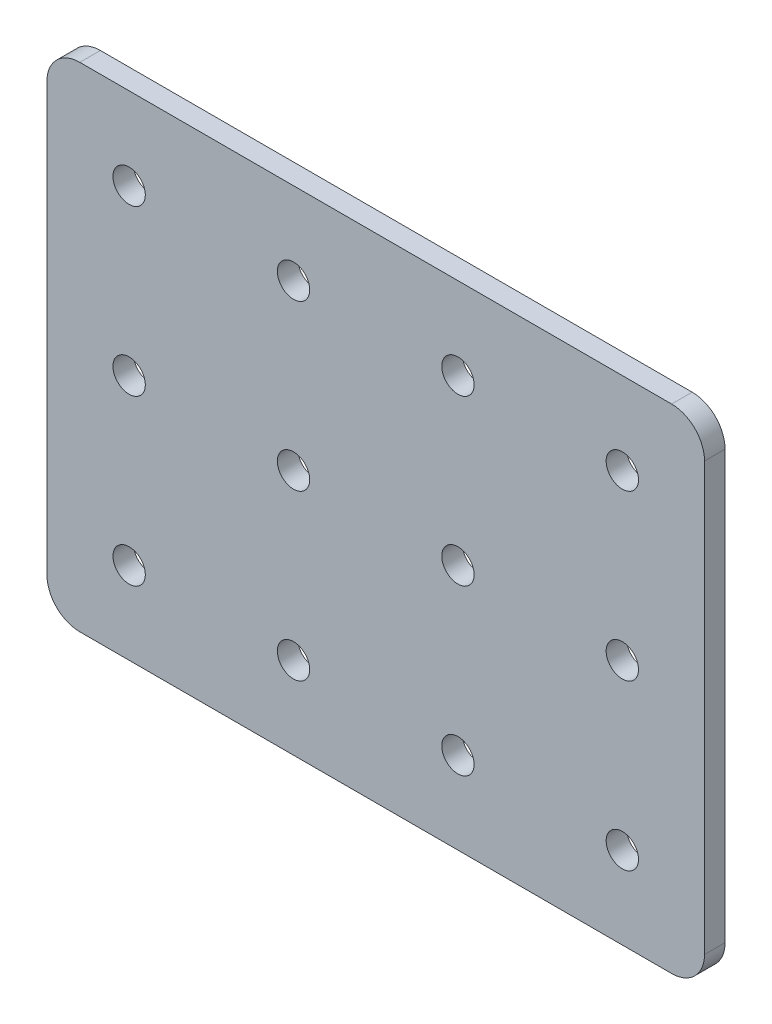
ISO-10303-21;
HEADER;
FILE_DESCRIPTION(('STEP AP214'),'2;1');
FILE_NAME('part.step','',(''),(''),'','','');
FILE_SCHEMA(('AUTOMOTIVE_DESIGN { 1 0 10303 214 1 1 1 1 }'));
ENDSEC;
DATA;
#1=APPLICATION_CONTEXT('core data for automotive mechanical design processes');
#2=APPLICATION_PROTOCOL_DEFINITION('international standard','automotive_design',2000,#1);
#3=PRODUCT_CONTEXT('',#1,'mechanical');
#4=PRODUCT('Part','Part','',(#3));
#5=PRODUCT_RELATED_PRODUCT_CATEGORY('part','',(#4));
#6=PRODUCT_DEFINITION_FORMATION('','',#4);
#7=PRODUCT_DEFINITION_CONTEXT('part definition',#1,'design');
#8=PRODUCT_DEFINITION('design','',#6,#7);
#9=PRODUCT_DEFINITION_SHAPE('','',#8);
#10=(LENGTH_UNIT() NAMED_UNIT(*) SI_UNIT(.MILLI.,.METRE.));
#11=(NAMED_UNIT(*) PLANE_ANGLE_UNIT() SI_UNIT($,.RADIAN.));
#12=(NAMED_UNIT(*) SI_UNIT($,.STERADIAN.) SOLID_ANGLE_UNIT());
#13=UNCERTAINTY_MEASURE_WITH_UNIT(LENGTH_MEASURE(1.E-05),#10,'distance_accuracy_value','');
#14=(GEOMETRIC_REPRESENTATION_CONTEXT(3) GLOBAL_UNCERTAINTY_ASSIGNED_CONTEXT((#13)) GLOBAL_UNIT_ASSIGNED_CONTEXT((#10,
#11,#12)) REPRESENTATION_CONTEXT('',''));
#15=CARTESIAN_POINT('',(0.,0.,0.));
#16=DIRECTION('',(0.,0.,1.));
#17=DIRECTION('',(1.,0.,0.));
#18=AXIS2_PLACEMENT_3D('',#15,#16,#17);
#19=CARTESIAN_POINT('',(71.12,71.1200000015277,-3251.19999999565));
#20=DIRECTION('',(0.,0.,-1.));
#21=DIRECTION('',(0.,1.,0.));
#22=AXIS2_PLACEMENT_3D('',#19,#20,#21);
#23=PLANE('',#22);
#24=CARTESIAN_POINT('',(63.5000000000037,38.1000000000156,-3251.19999999565));
#25=DIRECTION('',(0.,0.,-1.));
#26=DIRECTION('',(0.,1.,0.));
#27=AXIS2_PLACEMENT_3D('',#24,#25,#26);
#28=CIRCLE('',#27,2.4999999999987);
#29=CARTESIAN_POINT('',(63.5000000000037,40.6000000000143,-3251.19999999565));
#30=VERTEX_POINT('',#29);
#31=EDGE_CURVE('E688',#30,#30,#28,.T.);
#32=ORIENTED_EDGE('',*,*,#31,.F.);
#33=EDGE_LOOP('',(#32));
#34=FACE_BOUND('',#33,.T.);
#35=CARTESIAN_POINT('',(12.7000000000036,63.5000000000153,-3251.19999999565));
#36=DIRECTION('',(0.,0.,-1.));
#37=DIRECTION('',(0.,1.,0.));
#38=AXIS2_PLACEMENT_3D('',#35,#36,#37);
#39=CIRCLE('',#38,2.4999999999987);
#40=CARTESIAN_POINT('',(12.7000000000036,66.000000000014,-3251.19999999565));
#41=VERTEX_POINT('',#40);
#42=EDGE_CURVE('E700',#41,#41,#39,.T.);
#43=ORIENTED_EDGE('',*,*,#42,.F.);
#44=EDGE_LOOP('',(#43));
#45=FACE_BOUND('',#44,.T.);
#46=CARTESIAN_POINT('',(-12.6999999999963,38.1000000000151,-3251.19999999565));
#47=DIRECTION('',(0.,0.,-1.));
#48=DIRECTION('',(0.,1.,0.));
#49=AXIS2_PLACEMENT_3D('',#46,#47,#48);
#50=CIRCLE('',#49,2.4999999999987);
#51=CARTESIAN_POINT('',(-12.6999999999963,40.6000000000138,-3251.19999999565));
#52=VERTEX_POINT('',#51);
#53=EDGE_CURVE('E712',#52,#52,#50,.T.);
#54=ORIENTED_EDGE('',*,*,#53,.F.);
#55=EDGE_LOOP('',(#54));
#56=FACE_BOUND('',#55,.T.);
#57=CARTESIAN_POINT('',(38.1000000000037,38.1000000000155,-3251.19999999565));
#58=DIRECTION('',(0.,0.,-1.));
#59=DIRECTION('',(0.,1.,0.));
#60=AXIS2_PLACEMENT_3D('',#57,#58,#59);
#61=CIRCLE('',#60,2.4999999999987);
#62=CARTESIAN_POINT('',(38.1000000000037,40.6000000000142,-3251.19999999565));
#63=VERTEX_POINT('',#62);
#64=EDGE_CURVE('E724',#63,#63,#61,.T.);
#65=ORIENTED_EDGE('',*,*,#64,.F.);
#66=EDGE_LOOP('',(#65));
#67=FACE_BOUND('',#66,.T.);
#68=CARTESIAN_POINT('',(12.7000000000038,12.7000000000146,-3251.19999999565));
#69=DIRECTION('',(0.,0.,-1.));
#70=DIRECTION('',(0.,1.,0.));
#71=AXIS2_PLACEMENT_3D('',#68,#69,#70);
#72=CIRCLE('',#71,2.49999999999886);
#73=CARTESIAN_POINT('',(12.7000000000038,15.2000000000135,-3251.19999999565));
#74=VERTEX_POINT('',#73);
#75=EDGE_CURVE('E736',#74,#74,#72,.T.);
#76=ORIENTED_EDGE('',*,*,#75,.F.);
#77=EDGE_LOOP('',(#76));
#78=FACE_BOUND('',#77,.T.);
#79=CARTESIAN_POINT('',(63.5000000000038,12.7000000000156,-3251.19999999565));
#80=DIRECTION('',(0.,0.,-1.));
#81=DIRECTION('',(0.,1.,0.));
#82=AXIS2_PLACEMENT_3D('',#79,#80,#81);
#83=CIRCLE('',#82,2.4999999999987);
#84=CARTESIAN_POINT('',(63.5000000000038,15.2000000000143,-3251.19999999565));
#85=VERTEX_POINT('',#84);
#86=EDGE_CURVE('E456',#85,#85,#83,.T.);
#87=ORIENTED_EDGE('',*,*,#86,.F.);
#88=EDGE_LOOP('',(#87));
#89=FACE_BOUND('',#88,.T.);
#90=DIRECTION('',(0.,1.,0.));
#91=VECTOR('',#90,1.);
#92=CARTESIAN_POINT('',(76.2000000000005,76.2000000000041,-3251.19999999565));
#93=LINE('',#92,#91);
#94=CARTESIAN_POINT('',(76.1999999999938,5.08000000000008,-3251.19999999565));
#95=VERTEX_POINT('',#94);
#96=CARTESIAN_POINT('',(76.2,71.1200000015277,-3251.19999999565));
#97=VERTEX_POINT('',#96);
#98=EDGE_CURVE('E469',#95,#97,#93,.T.);
#99=ORIENTED_EDGE('',*,*,#98,.F.);
#100=CARTESIAN_POINT('',(71.1199999999938,5.08000000000008,-3251.19999999565));
#101=DIRECTION('',(0.,0.,-1.));
#102=DIRECTION('',(0.,1.,0.));
#103=AXIS2_PLACEMENT_3D('',#100,#101,#102);
#104=CIRCLE('',#103,5.07999999999999);
#105=CARTESIAN_POINT('',(71.1199999999938,0.,-3251.19999999565));
#106=VERTEX_POINT('',#105);
#107=EDGE_CURVE('E447',#95,#106,#104,.T.);
#108=ORIENTED_EDGE('',*,*,#107,.T.);
#109=DIRECTION('',(1.,0.,0.));
#110=VECTOR('',#109,1.);
#111=CARTESIAN_POINT('',(25.4,0.,-3251.19999999565));
#112=LINE('',#111,#110);
#113=CARTESIAN_POINT('',(-20.3199999999999,0.,-3251.19999999565));
#114=VERTEX_POINT('',#113);
#115=EDGE_CURVE('E432',#114,#106,#112,.T.);
#116=ORIENTED_EDGE('',*,*,#115,.F.);
#117=CARTESIAN_POINT('',(-20.32,5.08000000000003,-3251.19999999565));
#118=DIRECTION('',(0.,0.,-1.));
#119=DIRECTION('',(0.,1.,0.));
#120=AXIS2_PLACEMENT_3D('',#117,#118,#119);
#121=CIRCLE('',#120,5.08);
#122=CARTESIAN_POINT('',(-25.4,5.08000000000008,-3251.19999999565));
#123=VERTEX_POINT('',#122);
#124=EDGE_CURVE('E440',#114,#123,#121,.T.);
#125=ORIENTED_EDGE('',*,*,#124,.T.);
#126=DIRECTION('',(0.,1.,0.));
#127=VECTOR('',#126,1.);
#128=CARTESIAN_POINT('',(-25.4,76.2000000000089,-3251.19999999565));
#129=LINE('',#128,#127);
#130=CARTESIAN_POINT('',(-25.4,71.1200000015277,-3251.19999999565));
#131=VERTEX_POINT('',#130);
#132=EDGE_CURVE('E444',#123,#131,#129,.T.);
#133=ORIENTED_EDGE('',*,*,#132,.T.);
#134=CARTESIAN_POINT('',(-20.32,71.1200000015277,-3251.19999999565));
#135=DIRECTION('',(0.,0.,-1.));
#136=DIRECTION('',(0.,1.,0.));
#137=AXIS2_PLACEMENT_3D('',#134,#135,#136);
#138=CIRCLE('',#137,5.08000000000001);
#139=CARTESIAN_POINT('',(-20.32,76.2000000015277,-3251.19999999565));
#140=VERTEX_POINT('',#139);
#141=EDGE_CURVE('E497',#131,#140,#138,.T.);
#142=ORIENTED_EDGE('',*,*,#141,.T.);
#143=DIRECTION('',(1.,0.,0.));
#144=VECTOR('',#143,1.);
#145=CARTESIAN_POINT('',(25.4,76.2000000015277,-3251.19999999565));
#146=LINE('',#145,#144);
#147=CARTESIAN_POINT('',(71.12,76.2000000015277,-3251.19999999565));
#148=VERTEX_POINT('',#147);
#149=EDGE_CURVE('E490',#140,#148,#146,.T.);
#150=ORIENTED_EDGE('',*,*,#149,.T.);
#151=CARTESIAN_POINT('',(71.12,71.1200000015277,-3251.19999999565));
#152=DIRECTION('',(0.,0.,-1.));
#153=DIRECTION('',(0.,1.,0.));
#154=AXIS2_PLACEMENT_3D('',#151,#152,#153);
#155=CIRCLE('',#154,5.08);
#156=EDGE_CURVE('E415',#148,#97,#155,.T.);
#157=ORIENTED_EDGE('',*,*,#156,.T.);
#158=EDGE_LOOP('',(#99,#108,#116,#125,#133,#142,#150,#157));
#159=FACE_BOUND('',#158,.T.);
#160=CARTESIAN_POINT('',(-12.6999999999962,12.700000000014,-3251.19999999565));
#161=DIRECTION('',(0.,0.,-1.));
#162=DIRECTION('',(0.,1.,0.));
#163=AXIS2_PLACEMENT_3D('',#160,#161,#162);
#164=CIRCLE('',#163,2.49999999999887);
#165=CARTESIAN_POINT('',(-12.6999999999962,15.2000000000129,-3251.19999999565));
#166=VERTEX_POINT('',#165);
#167=EDGE_CURVE('E742',#166,#166,#164,.T.);
#168=ORIENTED_EDGE('',*,*,#167,.F.);
#169=EDGE_LOOP('',(#168));
#170=FACE_BOUND('',#169,.T.);
#171=CARTESIAN_POINT('',(38.1000000000038,12.7000000000151,-3251.19999999565));
#172=DIRECTION('',(0.,0.,-1.));
#173=DIRECTION('',(0.,1.,0.));
#174=AXIS2_PLACEMENT_3D('',#171,#172,#173);
#175=CIRCLE('',#174,2.49999999999887);
#176=CARTESIAN_POINT('',(38.1000000000038,15.200000000014,-3251.19999999565));
#177=VERTEX_POINT('',#176);
#178=EDGE_CURVE('E730',#177,#177,#175,.T.);
#179=ORIENTED_EDGE('',*,*,#178,.F.);
#180=EDGE_LOOP('',(#179));
#181=FACE_BOUND('',#180,.T.);
#182=CARTESIAN_POINT('',(12.7000000000037,38.1000000000153,-3251.19999999565));
#183=DIRECTION('',(0.,0.,-1.));
#184=DIRECTION('',(0.,1.,0.));
#185=AXIS2_PLACEMENT_3D('',#182,#183,#184);
#186=CIRCLE('',#185,2.4999999999987);
#187=CARTESIAN_POINT('',(12.7000000000037,40.600000000014,-3251.19999999565));
#188=VERTEX_POINT('',#187);
#189=EDGE_CURVE('E718',#188,#188,#186,.T.);
#190=ORIENTED_EDGE('',*,*,#189,.F.);
#191=EDGE_LOOP('',(#190));
#192=FACE_BOUND('',#191,.T.);
#193=CARTESIAN_POINT('',(38.1000000000036,63.5000000000154,-3251.19999999565));
#194=DIRECTION('',(0.,0.,-1.));
#195=DIRECTION('',(0.,1.,0.));
#196=AXIS2_PLACEMENT_3D('',#193,#194,#195);
#197=CIRCLE('',#196,2.4999999999987);
#198=CARTESIAN_POINT('',(38.1000000000036,66.0000000000141,-3251.19999999565));
#199=VERTEX_POINT('',#198);
#200=EDGE_CURVE('E706',#199,#199,#197,.T.);
#201=ORIENTED_EDGE('',*,*,#200,.F.);
#202=EDGE_LOOP('',(#201));
#203=FACE_BOUND('',#202,.T.);
#204=CARTESIAN_POINT('',(-12.6999999999964,63.5000000000151,-3251.19999999565));
#205=DIRECTION('',(0.,0.,-1.));
#206=DIRECTION('',(0.,1.,0.));
#207=AXIS2_PLACEMENT_3D('',#204,#205,#206);
#208=CIRCLE('',#207,2.4999999999987);
#209=CARTESIAN_POINT('',(-12.6999999999964,66.0000000000138,-3251.19999999565));
#210=VERTEX_POINT('',#209);
#211=EDGE_CURVE('E694',#210,#210,#208,.T.);
#212=ORIENTED_EDGE('',*,*,#211,.F.);
#213=EDGE_LOOP('',(#212));
#214=FACE_BOUND('',#213,.T.);
#215=CARTESIAN_POINT('',(63.5000000000036,63.5000000000156,-3251.19999999565));
#216=DIRECTION('',(0.,0.,-1.));
#217=DIRECTION('',(0.,1.,0.));
#218=AXIS2_PLACEMENT_3D('',#215,#216,#217);
#219=CIRCLE('',#218,2.4999999999987);
#220=CARTESIAN_POINT('',(63.5000000000036,66.0000000000143,-3251.19999999565));
#221=VERTEX_POINT('',#220);
#222=EDGE_CURVE('E679',#221,#221,#219,.T.);
#223=ORIENTED_EDGE('',*,*,#222,.F.);
#224=EDGE_LOOP('',(#223));
#225=FACE_BOUND('',#224,.T.);
#226=ADVANCED_FACE('F357',(#34,#45,#56,#67,#78,#89,#159,#170,#181,#192,#203,#214,#225),#23,.T.);
#227=CARTESIAN_POINT('',(71.12,71.1200000015277,-3248.02499999565));
#228=DIRECTION('',(0.,0.,-1.));
#229=DIRECTION('',(0.,1.,0.));
#230=AXIS2_PLACEMENT_3D('',#227,#228,#229);
#231=PLANE('',#230);
#232=DIRECTION('',(0.,1.,0.));
#233=VECTOR('',#232,1.);
#234=CARTESIAN_POINT('',(76.2000000000005,76.2000000000041,-3248.02499999565));
#235=LINE('',#234,#233);
#236=CARTESIAN_POINT('',(76.1999999999938,5.08000000000008,-3248.02499999565));
#237=VERTEX_POINT('',#236);
#238=CARTESIAN_POINT('',(76.2,71.1200000015277,-3248.02499999565));
#239=VERTEX_POINT('',#238);
#240=EDGE_CURVE('E452',#237,#239,#235,.T.);
#241=ORIENTED_EDGE('',*,*,#240,.T.);
#242=CARTESIAN_POINT('',(71.12,71.1200000015277,-3248.02499999565));
#243=DIRECTION('',(0.,0.,-1.));
#244=DIRECTION('',(0.,1.,0.));
#245=AXIS2_PLACEMENT_3D('',#242,#243,#244);
#246=CIRCLE('',#245,5.08);
#247=CARTESIAN_POINT('',(71.12,76.2000000015277,-3248.02499999565));
#248=VERTEX_POINT('',#247);
#249=EDGE_CURVE('E455',#248,#239,#246,.T.);
#250=ORIENTED_EDGE('',*,*,#249,.F.);
#251=DIRECTION('',(1.,0.,0.));
#252=VECTOR('',#251,1.);
#253=CARTESIAN_POINT('',(25.4,76.2000000015277,-3248.02499999565));
#254=LINE('',#253,#252);
#255=CARTESIAN_POINT('',(-20.32,76.2000000015277,-3248.02499999565));
#256=VERTEX_POINT('',#255);
#257=EDGE_CURVE('E459',#256,#248,#254,.T.);
#258=ORIENTED_EDGE('',*,*,#257,.F.);
#259=CARTESIAN_POINT('',(-20.32,71.1200000015277,-3248.02499999565));
#260=DIRECTION('',(0.,0.,-1.));
#261=DIRECTION('',(0.,1.,0.));
#262=AXIS2_PLACEMENT_3D('',#259,#260,#261);
#263=CIRCLE('',#262,5.08000000000001);
#264=CARTESIAN_POINT('',(-25.4,71.1200000015277,-3248.02499999565));
#265=VERTEX_POINT('',#264);
#266=EDGE_CURVE('E461',#265,#256,#263,.T.);
#267=ORIENTED_EDGE('',*,*,#266,.F.);
#268=DIRECTION('',(0.,1.,0.));
#269=VECTOR('',#268,1.);
#270=CARTESIAN_POINT('',(-25.4,76.2000000000089,-3248.02499999565));
#271=LINE('',#270,#269);
#272=CARTESIAN_POINT('',(-25.4,5.08000000000008,-3248.02499999565));
#273=VERTEX_POINT('',#272);
#274=EDGE_CURVE('E463',#273,#265,#271,.T.);
#275=ORIENTED_EDGE('',*,*,#274,.F.);
#276=CARTESIAN_POINT('',(-20.32,5.08000000000003,-3248.02499999565));
#277=DIRECTION('',(0.,0.,-1.));
#278=DIRECTION('',(0.,1.,0.));
#279=AXIS2_PLACEMENT_3D('',#276,#277,#278);
#280=CIRCLE('',#279,5.08);
#281=CARTESIAN_POINT('',(-20.3199999999999,0.,-3248.02499999565));
#282=VERTEX_POINT('',#281);
#283=EDGE_CURVE('E465',#282,#273,#280,.T.);
#284=ORIENTED_EDGE('',*,*,#283,.F.);
#285=DIRECTION('',(1.,0.,0.));
#286=VECTOR('',#285,1.);
#287=CARTESIAN_POINT('',(25.4,0.,-3248.02499999565));
#288=LINE('',#287,#286);
#289=CARTESIAN_POINT('',(71.1199999999938,0.,-3248.02499999565));
#290=VERTEX_POINT('',#289);
#291=EDGE_CURVE('E434',#282,#290,#288,.T.);
#292=ORIENTED_EDGE('',*,*,#291,.T.);
#293=CARTESIAN_POINT('',(71.1199999999938,5.08000000000008,-3248.02499999565));
#294=DIRECTION('',(0.,0.,-1.));
#295=DIRECTION('',(0.,1.,0.));
#296=AXIS2_PLACEMENT_3D('',#293,#294,#295);
#297=CIRCLE('',#296,5.07999999999999);
#298=EDGE_CURVE('E468',#237,#290,#297,.T.);
#299=ORIENTED_EDGE('',*,*,#298,.F.);
#300=EDGE_LOOP('',(#241,#250,#258,#267,#275,#284,#292,#299));
#301=FACE_BOUND('',#300,.T.);
#302=CARTESIAN_POINT('',(63.5000000000038,12.7000000000156,-3248.02499999565));
#303=DIRECTION('',(0.,0.,-1.));
#304=DIRECTION('',(0.,1.,0.));
#305=AXIS2_PLACEMENT_3D('',#302,#303,#304);
#306=CIRCLE('',#305,2.4999999999987);
#307=CARTESIAN_POINT('',(63.5000000000038,15.2000000000143,-3248.02499999565));
#308=VERTEX_POINT('',#307);
#309=EDGE_CURVE('E493',#308,#308,#306,.T.);
#310=ORIENTED_EDGE('',*,*,#309,.T.);
#311=EDGE_LOOP('',(#310));
#312=FACE_BOUND('',#311,.T.);
#313=CARTESIAN_POINT('',(-12.6999999999962,12.700000000014,-3248.02499999565));
#314=DIRECTION('',(0.,0.,-1.));
#315=DIRECTION('',(0.,1.,0.));
#316=AXIS2_PLACEMENT_3D('',#313,#314,#315);
#317=CIRCLE('',#316,2.49999999999887);
#318=CARTESIAN_POINT('',(-12.6999999999962,15.2000000000129,-3248.02499999565));
#319=VERTEX_POINT('',#318);
#320=EDGE_CURVE('E739',#319,#319,#317,.T.);
#321=ORIENTED_EDGE('',*,*,#320,.T.);
#322=EDGE_LOOP('',(#321));
#323=FACE_BOUND('',#322,.T.);
#324=CARTESIAN_POINT('',(12.7000000000038,12.7000000000146,-3248.02499999565));
#325=DIRECTION('',(0.,0.,-1.));
#326=DIRECTION('',(0.,1.,0.));
#327=AXIS2_PLACEMENT_3D('',#324,#325,#326);
#328=CIRCLE('',#327,2.49999999999886);
#329=CARTESIAN_POINT('',(12.7000000000038,15.2000000000135,-3248.02499999565));
#330=VERTEX_POINT('',#329);
#331=EDGE_CURVE('E733',#330,#330,#328,.T.);
#332=ORIENTED_EDGE('',*,*,#331,.T.);
#333=EDGE_LOOP('',(#332));
#334=FACE_BOUND('',#333,.T.);
#335=CARTESIAN_POINT('',(38.1000000000038,12.7000000000151,-3248.02499999565));
#336=DIRECTION('',(0.,0.,-1.));
#337=DIRECTION('',(0.,1.,0.));
#338=AXIS2_PLACEMENT_3D('',#335,#336,#337);
#339=CIRCLE('',#338,2.49999999999887);
#340=CARTESIAN_POINT('',(38.1000000000038,15.200000000014,-3248.02499999565));
#341=VERTEX_POINT('',#340);
#342=EDGE_CURVE('E727',#341,#341,#339,.T.);
#343=ORIENTED_EDGE('',*,*,#342,.T.);
#344=EDGE_LOOP('',(#343));
#345=FACE_BOUND('',#344,.T.);
#346=CARTESIAN_POINT('',(38.1000000000037,38.1000000000155,-3248.02499999565));
#347=DIRECTION('',(0.,0.,-1.));
#348=DIRECTION('',(0.,1.,0.));
#349=AXIS2_PLACEMENT_3D('',#346,#347,#348);
#350=CIRCLE('',#349,2.4999999999987);
#351=CARTESIAN_POINT('',(38.1000000000037,40.6000000000142,-3248.02499999565));
#352=VERTEX_POINT('',#351);
#353=EDGE_CURVE('E721',#352,#352,#350,.T.);
#354=ORIENTED_EDGE('',*,*,#353,.T.);
#355=EDGE_LOOP('',(#354));
#356=FACE_BOUND('',#355,.T.);
#357=CARTESIAN_POINT('',(12.7000000000037,38.1000000000153,-3248.02499999565));
#358=DIRECTION('',(0.,0.,-1.));
#359=DIRECTION('',(0.,1.,0.));
#360=AXIS2_PLACEMENT_3D('',#357,#358,#359);
#361=CIRCLE('',#360,2.4999999999987);
#362=CARTESIAN_POINT('',(12.7000000000037,40.600000000014,-3248.02499999565));
#363=VERTEX_POINT('',#362);
#364=EDGE_CURVE('E715',#363,#363,#361,.T.);
#365=ORIENTED_EDGE('',*,*,#364,.T.);
#366=EDGE_LOOP('',(#365));
#367=FACE_BOUND('',#366,.T.);
#368=CARTESIAN_POINT('',(-12.6999999999963,38.1000000000151,-3248.02499999565));
#369=DIRECTION('',(0.,0.,-1.));
#370=DIRECTION('',(0.,1.,0.));
#371=AXIS2_PLACEMENT_3D('',#368,#369,#370);
#372=CIRCLE('',#371,2.4999999999987);
#373=CARTESIAN_POINT('',(-12.6999999999963,40.6000000000138,-3248.02499999565));
#374=VERTEX_POINT('',#373);
#375=EDGE_CURVE('E709',#374,#374,#372,.T.);
#376=ORIENTED_EDGE('',*,*,#375,.T.);
#377=EDGE_LOOP('',(#376));
#378=FACE_BOUND('',#377,.T.);
#379=CARTESIAN_POINT('',(38.1000000000036,63.5000000000154,-3248.02499999565));
#380=DIRECTION('',(0.,0.,-1.));
#381=DIRECTION('',(0.,1.,0.));
#382=AXIS2_PLACEMENT_3D('',#379,#380,#381);
#383=CIRCLE('',#382,2.4999999999987);
#384=CARTESIAN_POINT('',(38.1000000000036,66.0000000000141,-3248.02499999565));
#385=VERTEX_POINT('',#384);
#386=EDGE_CURVE('E703',#385,#385,#383,.T.);
#387=ORIENTED_EDGE('',*,*,#386,.T.);
#388=EDGE_LOOP('',(#387));
#389=FACE_BOUND('',#388,.T.);
#390=CARTESIAN_POINT('',(12.7000000000036,63.5000000000153,-3248.02499999565));
#391=DIRECTION('',(0.,0.,-1.));
#392=DIRECTION('',(0.,1.,0.));
#393=AXIS2_PLACEMENT_3D('',#390,#391,#392);
#394=CIRCLE('',#393,2.4999999999987);
#395=CARTESIAN_POINT('',(12.7000000000036,66.000000000014,-3248.02499999565));
#396=VERTEX_POINT('',#395);
#397=EDGE_CURVE('E697',#396,#396,#394,.T.);
#398=ORIENTED_EDGE('',*,*,#397,.T.);
#399=EDGE_LOOP('',(#398));
#400=FACE_BOUND('',#399,.T.);
#401=CARTESIAN_POINT('',(-12.6999999999964,63.5000000000151,-3248.02499999565));
#402=DIRECTION('',(0.,0.,-1.));
#403=DIRECTION('',(0.,1.,0.));
#404=AXIS2_PLACEMENT_3D('',#401,#402,#403);
#405=CIRCLE('',#404,2.4999999999987);
#406=CARTESIAN_POINT('',(-12.6999999999964,66.0000000000138,-3248.02499999565));
#407=VERTEX_POINT('',#406);
#408=EDGE_CURVE('E691',#407,#407,#405,.T.);
#409=ORIENTED_EDGE('',*,*,#408,.T.);
#410=EDGE_LOOP('',(#409));
#411=FACE_BOUND('',#410,.T.);
#412=CARTESIAN_POINT('',(63.5000000000037,38.1000000000156,-3248.02499999565));
#413=DIRECTION('',(0.,0.,-1.));
#414=DIRECTION('',(0.,1.,0.));
#415=AXIS2_PLACEMENT_3D('',#412,#413,#414);
#416=CIRCLE('',#415,2.4999999999987);
#417=CARTESIAN_POINT('',(63.5000000000037,40.6000000000143,-3248.02499999565));
#418=VERTEX_POINT('',#417);
#419=EDGE_CURVE('E685',#418,#418,#416,.T.);
#420=ORIENTED_EDGE('',*,*,#419,.T.);
#421=EDGE_LOOP('',(#420));
#422=FACE_BOUND('',#421,.T.);
#423=CARTESIAN_POINT('',(63.5000000000036,63.5000000000156,-3248.02499999565));
#424=DIRECTION('',(0.,0.,-1.));
#425=DIRECTION('',(0.,1.,0.));
#426=AXIS2_PLACEMENT_3D('',#423,#424,#425);
#427=CIRCLE('',#426,2.4999999999987);
#428=CARTESIAN_POINT('',(63.5000000000036,66.0000000000143,-3248.02499999565));
#429=VERTEX_POINT('',#428);
#430=EDGE_CURVE('E682',#429,#429,#427,.T.);
#431=ORIENTED_EDGE('',*,*,#430,.T.);
#432=EDGE_LOOP('',(#431));
#433=FACE_BOUND('',#432,.T.);
#434=ADVANCED_FACE('F486',(#301,#312,#323,#334,#345,#356,#367,#378,#389,#400,#411,#422,#433),
#231,.F.);
#435=CARTESIAN_POINT('',(76.2000000000005,76.2000000000041,-3251.19999999565));
#436=DIRECTION('',(1.,0.,0.));
#437=DIRECTION('',(0.,1.,0.));
#438=AXIS2_PLACEMENT_3D('',#435,#436,#437);
#439=PLANE('',#438);
#440=ORIENTED_EDGE('',*,*,#240,.F.);
#441=DIRECTION('',(0.,0.,1.));
#442=VECTOR('',#441,1.);
#443=CARTESIAN_POINT('',(76.1999999999938,5.08000000000008,-3251.19999999565));
#444=LINE('',#443,#442);
#445=EDGE_CURVE('E12',#95,#237,#444,.T.);
#446=ORIENTED_EDGE('',*,*,#445,.F.);
#447=ORIENTED_EDGE('',*,*,#98,.T.);
#448=DIRECTION('',(0.,0.,1.));
#449=VECTOR('',#448,1.);
#450=CARTESIAN_POINT('',(76.2,71.1200000015277,-3251.19999999565));
#451=LINE('',#450,#449);
#452=EDGE_CURVE('E361',#97,#239,#451,.T.);
#453=ORIENTED_EDGE('',*,*,#452,.T.);
#454=EDGE_LOOP('',(#440,#446,#447,#453));
#455=FACE_BOUND('',#454,.T.);
#456=ADVANCED_FACE('F359',(#455),#439,.T.);
#457=CARTESIAN_POINT('',(71.1199999999938,5.08000000000008,-3251.19999999565));
#458=DIRECTION('',(0.,0.,1.));
#459=DIRECTION('',(1.,0.,0.));
#460=AXIS2_PLACEMENT_3D('',#457,#458,#459);
#461=CYLINDRICAL_SURFACE('',#460,5.07999999999999);
#462=ORIENTED_EDGE('',*,*,#298,.T.);
#463=DIRECTION('',(0.,0.,1.));
#464=VECTOR('',#463,1.);
#465=CARTESIAN_POINT('',(71.1199999999938,0.,-3251.19999999565));
#466=LINE('',#465,#464);
#467=EDGE_CURVE('E367',#106,#290,#466,.T.);
#468=ORIENTED_EDGE('',*,*,#467,.F.);
#469=ORIENTED_EDGE('',*,*,#107,.F.);
#470=ORIENTED_EDGE('',*,*,#445,.T.);
#471=EDGE_LOOP('',(#462,#468,#469,#470));
#472=FACE_BOUND('',#471,.T.);
#473=ADVANCED_FACE('F488',(#472),#461,.T.);
#474=CARTESIAN_POINT('',(25.4,0.,-3251.19999999565));
#475=DIRECTION('',(0.,-1.,0.));
#476=DIRECTION('',(1.,0.,0.));
#477=AXIS2_PLACEMENT_3D('',#474,#475,#476);
#478=PLANE('',#477);
#479=ORIENTED_EDGE('',*,*,#291,.F.);
#480=DIRECTION('',(0.,0.,1.));
#481=VECTOR('',#480,1.);
#482=CARTESIAN_POINT('',(-20.3199999999999,0.,-3251.19999999565));
#483=LINE('',#482,#481);
#484=EDGE_CURVE('E428',#114,#282,#483,.T.);
#485=ORIENTED_EDGE('',*,*,#484,.F.);
#486=ORIENTED_EDGE('',*,*,#115,.T.);
#487=ORIENTED_EDGE('',*,*,#467,.T.);
#488=EDGE_LOOP('',(#479,#485,#486,#487));
#489=FACE_BOUND('',#488,.T.);
#490=ADVANCED_FACE('F430',(#489),#478,.T.);
#491=CARTESIAN_POINT('',(-20.32,5.08000000000003,-3251.19999999565));
#492=DIRECTION('',(0.,0.,1.));
#493=DIRECTION('',(1.,0.,0.));
#494=AXIS2_PLACEMENT_3D('',#491,#492,#493);
#495=CYLINDRICAL_SURFACE('',#494,5.08);
#496=ORIENTED_EDGE('',*,*,#283,.T.);
#497=DIRECTION('',(0.,0.,1.));
#498=VECTOR('',#497,1.);
#499=CARTESIAN_POINT('',(-25.4,5.08000000000008,-3251.19999999565));
#500=LINE('',#499,#498);
#501=EDGE_CURVE('E437',#123,#273,#500,.T.);
#502=ORIENTED_EDGE('',*,*,#501,.F.);
#503=ORIENTED_EDGE('',*,*,#124,.F.);
#504=ORIENTED_EDGE('',*,*,#484,.T.);
#505=EDGE_LOOP('',(#496,#502,#503,#504));
#506=FACE_BOUND('',#505,.T.);
#507=ADVANCED_FACE('F441',(#506),#495,.T.);
#508=CARTESIAN_POINT('',(-25.4,76.2000000000089,-3251.19999999565));
#509=DIRECTION('',(1.,0.,0.));
#510=DIRECTION('',(0.,1.,0.));
#511=AXIS2_PLACEMENT_3D('',#508,#509,#510);
#512=PLANE('',#511);
#513=ORIENTED_EDGE('',*,*,#274,.T.);
#514=DIRECTION('',(0.,0.,1.));
#515=VECTOR('',#514,1.);
#516=CARTESIAN_POINT('',(-25.4,71.1200000015277,-3251.19999999565));
#517=LINE('',#516,#515);
#518=EDGE_CURVE('E473',#131,#265,#517,.T.);
#519=ORIENTED_EDGE('',*,*,#518,.F.);
#520=ORIENTED_EDGE('',*,*,#132,.F.);
#521=ORIENTED_EDGE('',*,*,#501,.T.);
#522=EDGE_LOOP('',(#513,#519,#520,#521));
#523=FACE_BOUND('',#522,.T.);
#524=ADVANCED_FACE('F502',(#523),#512,.F.);
#525=CARTESIAN_POINT('',(-20.32,71.1200000015277,-3251.19999999565));
#526=DIRECTION('',(0.,0.,1.));
#527=DIRECTION('',(1.,0.,0.));
#528=AXIS2_PLACEMENT_3D('',#525,#526,#527);
#529=CYLINDRICAL_SURFACE('',#528,5.08000000000001);
#530=ORIENTED_EDGE('',*,*,#266,.T.);
#531=DIRECTION('',(0.,0.,1.));
#532=VECTOR('',#531,1.);
#533=CARTESIAN_POINT('',(-20.32,76.2000000015277,-3251.19999999565));
#534=LINE('',#533,#532);
#535=EDGE_CURVE('E476',#140,#256,#534,.T.);
#536=ORIENTED_EDGE('',*,*,#535,.F.);
#537=ORIENTED_EDGE('',*,*,#141,.F.);
#538=ORIENTED_EDGE('',*,*,#518,.T.);
#539=EDGE_LOOP('',(#530,#536,#537,#538));
#540=FACE_BOUND('',#539,.T.);
#541=ADVANCED_FACE('F506',(#540),#529,.T.);
#542=CARTESIAN_POINT('',(25.4,76.2000000015277,-3251.19999999565));
#543=DIRECTION('',(0.,-1.,0.));
#544=DIRECTION('',(0.,0.,-1.));
#545=AXIS2_PLACEMENT_3D('',#542,#543,#544);
#546=PLANE('',#545);
#547=ORIENTED_EDGE('',*,*,#257,.T.);
#548=DIRECTION('',(0.,0.,1.));
#549=VECTOR('',#548,1.);
#550=CARTESIAN_POINT('',(71.12,76.2000000015277,-3251.19999999565));
#551=LINE('',#550,#549);
#552=EDGE_CURVE('E478',#148,#248,#551,.T.);
#553=ORIENTED_EDGE('',*,*,#552,.F.);
#554=ORIENTED_EDGE('',*,*,#149,.F.);
#555=ORIENTED_EDGE('',*,*,#535,.T.);
#556=EDGE_LOOP('',(#547,#553,#554,#555));
#557=FACE_BOUND('',#556,.T.);
#558=ADVANCED_FACE('F509',(#557),#546,.F.);
#559=CARTESIAN_POINT('',(71.12,71.1200000015277,-3251.19999999565));
#560=DIRECTION('',(0.,0.,1.));
#561=DIRECTION('',(1.,0.,0.));
#562=AXIS2_PLACEMENT_3D('',#559,#560,#561);
#563=CYLINDRICAL_SURFACE('',#562,5.08);
#564=ORIENTED_EDGE('',*,*,#249,.T.);
#565=ORIENTED_EDGE('',*,*,#452,.F.);
#566=ORIENTED_EDGE('',*,*,#156,.F.);
#567=ORIENTED_EDGE('',*,*,#552,.T.);
#568=EDGE_LOOP('',(#564,#565,#566,#567));
#569=FACE_BOUND('',#568,.T.);
#570=ADVANCED_FACE('F483',(#569),#563,.T.);
#571=CARTESIAN_POINT('',(63.5000000000038,12.7000000000156,-3251.19999999565));
#572=DIRECTION('',(0.,0.,1.));
#573=DIRECTION('',(1.,0.,0.));
#574=AXIS2_PLACEMENT_3D('',#571,#572,#573);
#575=CYLINDRICAL_SURFACE('',#574,2.4999999999987);
#576=ORIENTED_EDGE('',*,*,#86,.T.);
#577=EDGE_LOOP('',(#576));
#578=FACE_BOUND('',#577,.T.);
#579=ORIENTED_EDGE('',*,*,#309,.F.);
#580=EDGE_LOOP('',(#579));
#581=FACE_BOUND('',#580,.T.);
#582=ADVANCED_FACE('F516',(#578,#581),#575,.F.);
#583=CARTESIAN_POINT('',(-12.6999999999962,12.700000000014,-3251.19999999565));
#584=DIRECTION('',(0.,0.,1.));
#585=DIRECTION('',(1.,0.,0.));
#586=AXIS2_PLACEMENT_3D('',#583,#584,#585);
#587=CYLINDRICAL_SURFACE('',#586,2.49999999999887);
#588=ORIENTED_EDGE('',*,*,#167,.T.);
#589=EDGE_LOOP('',(#588));
#590=FACE_BOUND('',#589,.T.);
#591=ORIENTED_EDGE('',*,*,#320,.F.);
#592=EDGE_LOOP('',(#591));
#593=FACE_BOUND('',#592,.T.);
#594=ADVANCED_FACE('F564',(#590,#593),#587,.F.);
#595=CARTESIAN_POINT('',(12.7000000000038,12.7000000000146,-3251.19999999565));
#596=DIRECTION('',(0.,0.,1.));
#597=DIRECTION('',(1.,0.,0.));
#598=AXIS2_PLACEMENT_3D('',#595,#596,#597);
#599=CYLINDRICAL_SURFACE('',#598,2.49999999999886);
#600=ORIENTED_EDGE('',*,*,#75,.T.);
#601=EDGE_LOOP('',(#600));
#602=FACE_BOUND('',#601,.T.);
#603=ORIENTED_EDGE('',*,*,#331,.F.);
#604=EDGE_LOOP('',(#603));
#605=FACE_BOUND('',#604,.T.);
#606=ADVANCED_FACE('F573',(#602,#605),#599,.F.);
#607=CARTESIAN_POINT('',(38.1000000000038,12.7000000000151,-3251.19999999565));
#608=DIRECTION('',(0.,0.,1.));
#609=DIRECTION('',(1.,0.,0.));
#610=AXIS2_PLACEMENT_3D('',#607,#608,#609);
#611=CYLINDRICAL_SURFACE('',#610,2.49999999999887);
#612=ORIENTED_EDGE('',*,*,#178,.T.);
#613=EDGE_LOOP('',(#612));
#614=FACE_BOUND('',#613,.T.);
#615=ORIENTED_EDGE('',*,*,#342,.F.);
#616=EDGE_LOOP('',(#615));
#617=FACE_BOUND('',#616,.T.);
#618=ADVANCED_FACE('F582',(#614,#617),#611,.F.);
#619=CARTESIAN_POINT('',(38.1000000000037,38.1000000000155,-3251.19999999565));
#620=DIRECTION('',(0.,0.,1.));
#621=DIRECTION('',(1.,0.,0.));
#622=AXIS2_PLACEMENT_3D('',#619,#620,#621);
#623=CYLINDRICAL_SURFACE('',#622,2.4999999999987);
#624=ORIENTED_EDGE('',*,*,#64,.T.);
#625=EDGE_LOOP('',(#624));
#626=FACE_BOUND('',#625,.T.);
#627=ORIENTED_EDGE('',*,*,#353,.F.);
#628=EDGE_LOOP('',(#627));
#629=FACE_BOUND('',#628,.T.);
#630=ADVANCED_FACE('F592',(#626,#629),#623,.F.);
#631=CARTESIAN_POINT('',(12.7000000000037,38.1000000000153,-3251.19999999565));
#632=DIRECTION('',(0.,0.,1.));
#633=DIRECTION('',(1.,0.,0.));
#634=AXIS2_PLACEMENT_3D('',#631,#632,#633);
#635=CYLINDRICAL_SURFACE('',#634,2.4999999999987);
#636=ORIENTED_EDGE('',*,*,#189,.T.);
#637=EDGE_LOOP('',(#636));
#638=FACE_BOUND('',#637,.T.);
#639=ORIENTED_EDGE('',*,*,#364,.F.);
#640=EDGE_LOOP('',(#639));
#641=FACE_BOUND('',#640,.T.);
#642=ADVANCED_FACE('F602',(#638,#641),#635,.F.);
#643=CARTESIAN_POINT('',(-12.6999999999963,38.1000000000151,-3251.19999999565));
#644=DIRECTION('',(0.,0.,1.));
#645=DIRECTION('',(1.,0.,0.));
#646=AXIS2_PLACEMENT_3D('',#643,#644,#645);
#647=CYLINDRICAL_SURFACE('',#646,2.4999999999987);
#648=ORIENTED_EDGE('',*,*,#53,.T.);
#649=EDGE_LOOP('',(#648));
#650=FACE_BOUND('',#649,.T.);
#651=ORIENTED_EDGE('',*,*,#375,.F.);
#652=EDGE_LOOP('',(#651));
#653=FACE_BOUND('',#652,.T.);
#654=ADVANCED_FACE('F612',(#650,#653),#647,.F.);
#655=CARTESIAN_POINT('',(38.1000000000036,63.5000000000154,-3251.19999999565));
#656=DIRECTION('',(0.,0.,1.));
#657=DIRECTION('',(1.,0.,0.));
#658=AXIS2_PLACEMENT_3D('',#655,#656,#657);
#659=CYLINDRICAL_SURFACE('',#658,2.4999999999987);
#660=ORIENTED_EDGE('',*,*,#200,.T.);
#661=EDGE_LOOP('',(#660));
#662=FACE_BOUND('',#661,.T.);
#663=ORIENTED_EDGE('',*,*,#386,.F.);
#664=EDGE_LOOP('',(#663));
#665=FACE_BOUND('',#664,.T.);
#666=ADVANCED_FACE('F622',(#662,#665),#659,.F.);
#667=CARTESIAN_POINT('',(12.7000000000036,63.5000000000153,-3251.19999999565));
#668=DIRECTION('',(0.,0.,1.));
#669=DIRECTION('',(1.,0.,0.));
#670=AXIS2_PLACEMENT_3D('',#667,#668,#669);
#671=CYLINDRICAL_SURFACE('',#670,2.4999999999987);
#672=ORIENTED_EDGE('',*,*,#42,.T.);
#673=EDGE_LOOP('',(#672));
#674=FACE_BOUND('',#673,.T.);
#675=ORIENTED_EDGE('',*,*,#397,.F.);
#676=EDGE_LOOP('',(#675));
#677=FACE_BOUND('',#676,.T.);
#678=ADVANCED_FACE('F632',(#674,#677),#671,.F.);
#679=CARTESIAN_POINT('',(-12.6999999999964,63.5000000000151,-3251.19999999565));
#680=DIRECTION('',(0.,0.,1.));
#681=DIRECTION('',(1.,0.,0.));
#682=AXIS2_PLACEMENT_3D('',#679,#680,#681);
#683=CYLINDRICAL_SURFACE('',#682,2.4999999999987);
#684=ORIENTED_EDGE('',*,*,#211,.T.);
#685=EDGE_LOOP('',(#684));
#686=FACE_BOUND('',#685,.T.);
#687=ORIENTED_EDGE('',*,*,#408,.F.);
#688=EDGE_LOOP('',(#687));
#689=FACE_BOUND('',#688,.T.);
#690=ADVANCED_FACE('F642',(#686,#689),#683,.F.);
#691=CARTESIAN_POINT('',(63.5000000000037,38.1000000000156,-3251.19999999565));
#692=DIRECTION('',(0.,0.,1.));
#693=DIRECTION('',(1.,0.,0.));
#694=AXIS2_PLACEMENT_3D('',#691,#692,#693);
#695=CYLINDRICAL_SURFACE('',#694,2.4999999999987);
#696=ORIENTED_EDGE('',*,*,#31,.T.);
#697=EDGE_LOOP('',(#696));
#698=FACE_BOUND('',#697,.T.);
#699=ORIENTED_EDGE('',*,*,#419,.F.);
#700=EDGE_LOOP('',(#699));
#701=FACE_BOUND('',#700,.T.);
#702=ADVANCED_FACE('F652',(#698,#701),#695,.F.);
#703=CARTESIAN_POINT('',(63.5000000000036,63.5000000000156,-3251.19999999565));
#704=DIRECTION('',(0.,0.,1.));
#705=DIRECTION('',(1.,0.,0.));
#706=AXIS2_PLACEMENT_3D('',#703,#704,#705);
#707=CYLINDRICAL_SURFACE('',#706,2.4999999999987);
#708=ORIENTED_EDGE('',*,*,#222,.T.);
#709=EDGE_LOOP('',(#708));
#710=FACE_BOUND('',#709,.T.);
#711=ORIENTED_EDGE('',*,*,#430,.F.);
#712=EDGE_LOOP('',(#711));
#713=FACE_BOUND('',#712,.T.);
#714=ADVANCED_FACE('F662',(#710,#713),#707,.F.);
#715=CLOSED_SHELL('',(#226,#434,#456,#473,#490,#507,#524,#541,#558,#570,#582,#594,#606,#618,
#630,#642,#654,#666,#678,#690,#702,#714));
#716=MANIFOLD_SOLID_BREP('B2',#715);
#717=ADVANCED_BREP_SHAPE_REPRESENTATION('',(#18,#716),#14);
#718=SHAPE_DEFINITION_REPRESENTATION(#9,#717);
ENDSEC;
END-ISO-10303-21;
